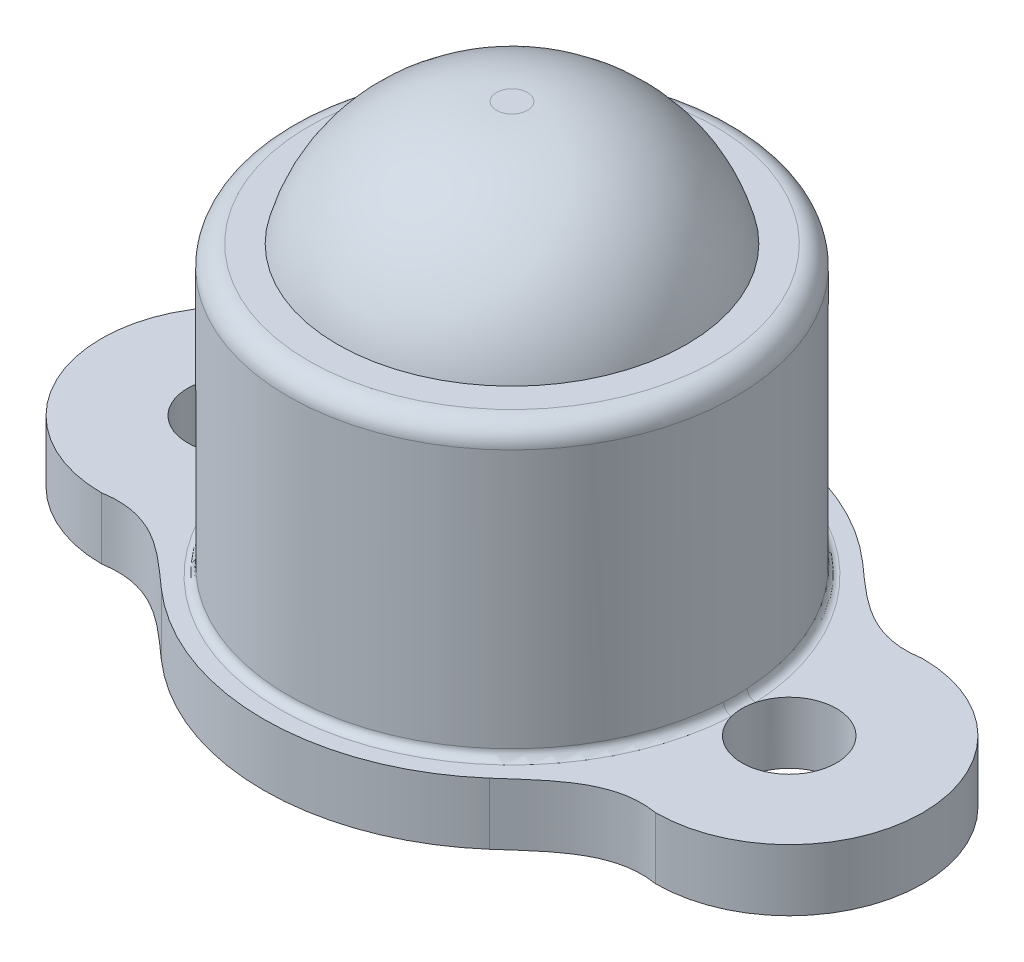
ISO-10303-21;
HEADER;
FILE_DESCRIPTION(('STEP AP214'),'2;1');
FILE_NAME('part.step','',(''),(''),'','','');
FILE_SCHEMA(('AUTOMOTIVE_DESIGN { 1 0 10303 214 1 1 1 1 }'));
ENDSEC;
DATA;
#1=APPLICATION_CONTEXT('core data for automotive mechanical design processes');
#2=APPLICATION_PROTOCOL_DEFINITION('international standard','automotive_design',2000,#1);
#3=PRODUCT_CONTEXT('',#1,'mechanical');
#4=PRODUCT('Part','Part','',(#3));
#5=PRODUCT_RELATED_PRODUCT_CATEGORY('part','',(#4));
#6=PRODUCT_DEFINITION_FORMATION('','',#4);
#7=PRODUCT_DEFINITION_CONTEXT('part definition',#1,'design');
#8=PRODUCT_DEFINITION('design','',#6,#7);
#9=PRODUCT_DEFINITION_SHAPE('','',#8);
#10=(LENGTH_UNIT() NAMED_UNIT(*) SI_UNIT(.MILLI.,.METRE.));
#11=(NAMED_UNIT(*) PLANE_ANGLE_UNIT() SI_UNIT($,.RADIAN.));
#12=(NAMED_UNIT(*) SI_UNIT($,.STERADIAN.) SOLID_ANGLE_UNIT());
#13=UNCERTAINTY_MEASURE_WITH_UNIT(LENGTH_MEASURE(1.E-05),#10,'distance_accuracy_value','');
#14=(GEOMETRIC_REPRESENTATION_CONTEXT(3) GLOBAL_UNCERTAINTY_ASSIGNED_CONTEXT((#13)) GLOBAL_UNIT_ASSIGNED_CONTEXT((#10,
#11,#12)) REPRESENTATION_CONTEXT('',''));
#15=CARTESIAN_POINT('',(0.,0.,0.));
#16=DIRECTION('',(0.,0.,1.));
#17=DIRECTION('',(1.,0.,0.));
#18=AXIS2_PLACEMENT_3D('',#15,#16,#17);
#19=CARTESIAN_POINT('',(0.,8.5,0.));
#20=DIRECTION('',(0.,1.,0.));
#21=DIRECTION('',(0.,0.,1.));
#22=AXIS2_PLACEMENT_3D('',#19,#20,#21);
#23=PLANE('',#22);
#24=CARTESIAN_POINT('',(0.,8.5,0.));
#25=DIRECTION('',(0.,1.,0.));
#26=DIRECTION('',(0.,0.,1.));
#27=AXIS2_PLACEMENT_3D('',#24,#25,#26);
#28=CIRCLE('',#27,4.94689619894046);
#29=CARTESIAN_POINT('',(0.,8.5,4.94689619894046));
#30=VERTEX_POINT('',#29);
#31=EDGE_CURVE('E154',#30,#30,#28,.T.);
#32=ORIENTED_EDGE('',*,*,#31,.T.);
#33=EDGE_LOOP('',(#32));
#34=FACE_BOUND('',#33,.T.);
#35=CARTESIAN_POINT('',(0.,8.5,0.));
#36=DIRECTION('',(0.,1.,0.));
#37=DIRECTION('',(0.,0.,1.));
#38=AXIS2_PLACEMENT_3D('',#35,#36,#37);
#39=CIRCLE('',#38,4.25);
#40=CARTESIAN_POINT('',(0.,8.5,4.25));
#41=VERTEX_POINT('',#40);
#42=EDGE_CURVE('E209',#41,#41,#39,.T.);
#43=ORIENTED_EDGE('',*,*,#42,.F.);
#44=EDGE_LOOP('',(#43));
#45=FACE_BOUND('',#44,.T.);
#46=ADVANCED_FACE('F36',(#34,#45),#23,.T.);
#47=CARTESIAN_POINT('',(0.,1.5,0.));
#48=DIRECTION('',(0.,1.,0.));
#49=DIRECTION('',(0.,0.,1.));
#50=AXIS2_PLACEMENT_3D('',#47,#48,#49);
#51=PLANE('',#50);
#52=CARTESIAN_POINT('',(-6.75,1.5,0.));
#53=DIRECTION('',(0.,1.,0.));
#54=DIRECTION('',(0.,0.,1.));
#55=AXIS2_PLACEMENT_3D('',#52,#53,#54);
#56=CIRCLE('',#55,3.25);
#57=CARTESIAN_POINT('',(-6.75,1.5,-3.25));
#58=VERTEX_POINT('',#57);
#59=CARTESIAN_POINT('',(-6.75,1.5,3.25));
#60=VERTEX_POINT('',#59);
#61=EDGE_CURVE('E138',#58,#60,#56,.T.);
#62=ORIENTED_EDGE('',*,*,#61,.T.);
#63=CARTESIAN_POINT('',(-6.75,1.5,3.25));
#64=CARTESIAN_POINT('',(-5.55717228419837,1.5,3.04653552216127));
#65=CARTESIAN_POINT('',(-4.77819611655397,1.5,3.85536844071539));
#66=CARTESIAN_POINT('',(-3.99231353485115,1.5,4.54575985281276));
#67=B_SPLINE_CURVE_WITH_KNOTS('',3,(#63,#64,#65,#66),.UNSPECIFIED.,.F.,.F.,(4,4),(0.,1.),.UNSPECIFIED.);
#68=CARTESIAN_POINT('',(-3.99231353485115,1.5,4.54575985281276));
#69=VERTEX_POINT('',#68);
#70=EDGE_CURVE('E127',#60,#69,#67,.T.);
#71=ORIENTED_EDGE('',*,*,#70,.T.);
#72=CARTESIAN_POINT('',(0.,1.5,0.));
#73=DIRECTION('',(0.,1.,0.));
#74=DIRECTION('',(0.,0.,1.));
#75=AXIS2_PLACEMENT_3D('',#72,#73,#74);
#76=CIRCLE('',#75,6.05);
#77=CARTESIAN_POINT('',(3.99231353485115,1.5,4.54575985281276));
#78=VERTEX_POINT('',#77);
#79=EDGE_CURVE('E137',#69,#78,#76,.T.);
#80=ORIENTED_EDGE('',*,*,#79,.T.);
#81=CARTESIAN_POINT('',(6.75,1.5,3.25));
#82=CARTESIAN_POINT('',(5.55717228419837,1.5,3.04653552216127));
#83=CARTESIAN_POINT('',(4.77819611655397,1.5,3.85536844071539));
#84=CARTESIAN_POINT('',(3.99231353485115,1.5,4.54575985281276));
#85=B_SPLINE_CURVE_WITH_KNOTS('',3,(#81,#82,#83,#84),.UNSPECIFIED.,.F.,.F.,(4,4),(0.,1.),.UNSPECIFIED.);
#86=CARTESIAN_POINT('',(6.75,1.5,3.25));
#87=VERTEX_POINT('',#86);
#88=EDGE_CURVE('E281',#87,#78,#85,.T.);
#89=ORIENTED_EDGE('',*,*,#88,.F.);
#90=CARTESIAN_POINT('',(6.75,1.5,0.));
#91=DIRECTION('',(0.,1.,0.));
#92=DIRECTION('',(0.,0.,1.));
#93=AXIS2_PLACEMENT_3D('',#90,#91,#92);
#94=CIRCLE('',#93,3.25);
#95=CARTESIAN_POINT('',(6.75,1.5,-3.25));
#96=VERTEX_POINT('',#95);
#97=EDGE_CURVE('E288',#96,#87,#94,.F.);
#98=ORIENTED_EDGE('',*,*,#97,.F.);
#99=CARTESIAN_POINT('',(6.75,1.5,-3.25));
#100=CARTESIAN_POINT('',(5.55717228419837,1.5,-3.04653552216127));
#101=CARTESIAN_POINT('',(4.77819611655397,1.5,-3.85536844071539));
#102=CARTESIAN_POINT('',(3.99231353485115,1.5,-4.54575985281276));
#103=B_SPLINE_CURVE_WITH_KNOTS('',3,(#99,#100,#101,#102),.UNSPECIFIED.,.F.,.F.,(4,4),(0.,1.),.UNSPECIFIED.);
#104=CARTESIAN_POINT('',(3.99231353485115,1.5,-4.54575985281276));
#105=VERTEX_POINT('',#104);
#106=EDGE_CURVE('E294',#96,#105,#103,.T.);
#107=ORIENTED_EDGE('',*,*,#106,.T.);
#108=CARTESIAN_POINT('',(-3.99231353485115,1.5,-4.54575985281276));
#109=VERTEX_POINT('',#108);
#110=EDGE_CURVE('E282',#105,#109,#76,.T.);
#111=ORIENTED_EDGE('',*,*,#110,.T.);
#112=CARTESIAN_POINT('',(-6.75,1.5,-3.25));
#113=CARTESIAN_POINT('',(-5.55717228419837,1.5,-3.04653552216127));
#114=CARTESIAN_POINT('',(-4.77819611655397,1.5,-3.85536844071539));
#115=CARTESIAN_POINT('',(-3.99231353485115,1.5,-4.54575985281276));
#116=B_SPLINE_CURVE_WITH_KNOTS('',3,(#112,#113,#114,#115),.UNSPECIFIED.,.F.,.F.,(4,4),(0.,1.),.UNSPECIFIED.);
#117=EDGE_CURVE('E144',#58,#109,#116,.T.);
#118=ORIENTED_EDGE('',*,*,#117,.F.);
#119=EDGE_LOOP('',(#62,#71,#80,#89,#98,#107,#111,#118));
#120=FACE_BOUND('',#119,.T.);
#121=CARTESIAN_POINT('',(-6.75,1.5,0.));
#122=DIRECTION('',(0.,1.,0.));
#123=DIRECTION('',(0.,0.,1.));
#124=AXIS2_PLACEMENT_3D('',#121,#122,#123);
#125=CIRCLE('',#124,1.15);
#126=CARTESIAN_POINT('',(-5.63906938382283,1.5,-0.297208960228696));
#127=VERTEX_POINT('',#126);
#128=CARTESIAN_POINT('',(-5.63906938382283,1.5,0.297208960228696));
#129=VERTEX_POINT('',#128);
#130=EDGE_CURVE('E393',#127,#129,#125,.T.);
#131=ORIENTED_EDGE('',*,*,#130,.F.);
#132=CARTESIAN_POINT('',(0.,1.5,0.));
#133=DIRECTION('',(0.,1.,0.));
#134=DIRECTION('',(0.,0.,1.));
#135=AXIS2_PLACEMENT_3D('',#132,#133,#134);
#136=CIRCLE('',#135,5.64689619894046);
#137=CARTESIAN_POINT('',(5.63906938382283,1.5,-0.297208960228695));
#138=VERTEX_POINT('',#137);
#139=EDGE_CURVE('E11',#127,#138,#136,.F.);
#140=ORIENTED_EDGE('',*,*,#139,.T.);
#141=CARTESIAN_POINT('',(6.75,1.5,0.));
#142=DIRECTION('',(0.,1.,0.));
#143=DIRECTION('',(0.,0.,-1.));
#144=AXIS2_PLACEMENT_3D('',#141,#142,#143);
#145=CIRCLE('',#144,1.15);
#146=CARTESIAN_POINT('',(5.63906938382283,1.5,0.297208960228699));
#147=VERTEX_POINT('',#146);
#148=EDGE_CURVE('E55',#147,#138,#145,.T.);
#149=ORIENTED_EDGE('',*,*,#148,.F.);
#150=CARTESIAN_POINT('',(0.,1.5,0.));
#151=DIRECTION('',(0.,1.,0.));
#152=DIRECTION('',(0.,0.,1.));
#153=AXIS2_PLACEMENT_3D('',#150,#151,#152);
#154=CIRCLE('',#153,5.64689619894046);
#155=EDGE_CURVE('E48',#147,#129,#154,.F.);
#156=ORIENTED_EDGE('',*,*,#155,.T.);
#157=EDGE_LOOP('',(#131,#140,#149,#156));
#158=FACE_BOUND('',#157,.T.);
#159=ADVANCED_FACE('F142',(#120,#158),#51,.T.);
#160=CARTESIAN_POINT('',(-6.75,1.5,0.));
#161=DIRECTION('',(0.,-1.,0.));
#162=DIRECTION('',(0.,0.,-1.));
#163=AXIS2_PLACEMENT_3D('',#160,#161,#162);
#164=CYLINDRICAL_SURFACE('',#163,3.25);
#165=CARTESIAN_POINT('',(-6.75,0.,0.));
#166=DIRECTION('',(0.,1.,0.));
#167=DIRECTION('',(0.,0.,1.));
#168=AXIS2_PLACEMENT_3D('',#165,#166,#167);
#169=CIRCLE('',#168,3.25);
#170=CARTESIAN_POINT('',(-6.75,0.,-3.25));
#171=VERTEX_POINT('',#170);
#172=CARTESIAN_POINT('',(-6.75,0.,3.25));
#173=VERTEX_POINT('',#172);
#174=EDGE_CURVE('E150',#171,#173,#169,.T.);
#175=ORIENTED_EDGE('',*,*,#174,.T.);
#176=DIRECTION('',(0.,-1.,0.));
#177=VECTOR('',#176,1.);
#178=CARTESIAN_POINT('',(-6.75,1.5,3.25));
#179=LINE('',#178,#177);
#180=EDGE_CURVE('E131',#60,#173,#179,.T.);
#181=ORIENTED_EDGE('',*,*,#180,.F.);
#182=ORIENTED_EDGE('',*,*,#61,.F.);
#183=DIRECTION('',(0.,-1.,0.));
#184=VECTOR('',#183,1.);
#185=CARTESIAN_POINT('',(-6.75,1.5,-3.25));
#186=LINE('',#185,#184);
#187=EDGE_CURVE('E356',#58,#171,#186,.T.);
#188=ORIENTED_EDGE('',*,*,#187,.T.);
#189=EDGE_LOOP('',(#175,#181,#182,#188));
#190=FACE_BOUND('',#189,.T.);
#191=ADVANCED_FACE('F148',(#190),#164,.T.);
#192=DIRECTION('',(0.,-1.,0.));
#193=VECTOR('',#192,1.);
#194=SURFACE_OF_LINEAR_EXTRUSION('',#67,#193);
#195=CARTESIAN_POINT('',(-6.75,0.,3.25));
#196=CARTESIAN_POINT('',(-5.55717228419837,0.,3.04653552216127));
#197=CARTESIAN_POINT('',(-4.77819611655397,0.,3.85536844071539));
#198=CARTESIAN_POINT('',(-3.99231353485115,0.,4.54575985281276));
#199=B_SPLINE_CURVE_WITH_KNOTS('',3,(#195,#196,#197,#198),.UNSPECIFIED.,.F.,.F.,(4,4),(0.,1.),.UNSPECIFIED.);
#200=CARTESIAN_POINT('',(-3.99231353485115,0.,4.54575985281276));
#201=VERTEX_POINT('',#200);
#202=EDGE_CURVE('E369',#173,#201,#199,.T.);
#203=ORIENTED_EDGE('',*,*,#202,.T.);
#204=DIRECTION('',(0.,-1.,0.));
#205=VECTOR('',#204,1.);
#206=CARTESIAN_POINT('',(-3.99231353485115,1.5,4.54575985281276));
#207=LINE('',#206,#205);
#208=EDGE_CURVE('E134',#69,#201,#207,.T.);
#209=ORIENTED_EDGE('',*,*,#208,.F.);
#210=ORIENTED_EDGE('',*,*,#70,.F.);
#211=ORIENTED_EDGE('',*,*,#180,.T.);
#212=EDGE_LOOP('',(#203,#209,#210,#211));
#213=FACE_BOUND('',#212,.T.);
#214=ADVANCED_FACE('F129',(#213),#194,.F.);
#215=CARTESIAN_POINT('',(0.,1.5,0.));
#216=DIRECTION('',(0.,-1.,0.));
#217=DIRECTION('',(0.,0.,-1.));
#218=AXIS2_PLACEMENT_3D('',#215,#216,#217);
#219=CYLINDRICAL_SURFACE('',#218,6.05);
#220=CARTESIAN_POINT('',(0.,0.,0.));
#221=DIRECTION('',(0.,1.,0.));
#222=DIRECTION('',(0.,0.,1.));
#223=AXIS2_PLACEMENT_3D('',#220,#221,#222);
#224=CIRCLE('',#223,6.05);
#225=CARTESIAN_POINT('',(3.99231353485115,0.,4.54575985281276));
#226=VERTEX_POINT('',#225);
#227=EDGE_CURVE('E335',#201,#226,#224,.T.);
#228=ORIENTED_EDGE('',*,*,#227,.T.);
#229=DIRECTION('',(0.,-1.,0.));
#230=VECTOR('',#229,1.);
#231=CARTESIAN_POINT('',(3.99231353485115,1.5,4.54575985281276));
#232=LINE('',#231,#230);
#233=EDGE_CURVE('E156',#78,#226,#232,.T.);
#234=ORIENTED_EDGE('',*,*,#233,.F.);
#235=ORIENTED_EDGE('',*,*,#79,.F.);
#236=ORIENTED_EDGE('',*,*,#208,.T.);
#237=EDGE_LOOP('',(#228,#234,#235,#236));
#238=FACE_BOUND('',#237,.T.);
#239=ADVANCED_FACE('F269',(#238),#219,.T.);
#240=DIRECTION('',(0.,-1.,0.));
#241=VECTOR('',#240,1.);
#242=SURFACE_OF_LINEAR_EXTRUSION('',#85,#241);
#243=CARTESIAN_POINT('',(6.75,0.,3.25));
#244=CARTESIAN_POINT('',(5.55717228419837,0.,3.04653552216127));
#245=CARTESIAN_POINT('',(4.77819611655397,0.,3.85536844071539));
#246=CARTESIAN_POINT('',(3.99231353485115,0.,4.54575985281276));
#247=B_SPLINE_CURVE_WITH_KNOTS('',3,(#243,#244,#245,#246),.UNSPECIFIED.,.F.,.F.,(4,4),(0.,1.),.UNSPECIFIED.);
#248=CARTESIAN_POINT('',(6.75,0.,3.25));
#249=VERTEX_POINT('',#248);
#250=EDGE_CURVE('E331',#249,#226,#247,.T.);
#251=ORIENTED_EDGE('',*,*,#250,.F.);
#252=DIRECTION('',(0.,-1.,0.));
#253=VECTOR('',#252,1.);
#254=CARTESIAN_POINT('',(6.75,1.5,3.25));
#255=LINE('',#254,#253);
#256=EDGE_CURVE('E325',#87,#249,#255,.T.);
#257=ORIENTED_EDGE('',*,*,#256,.F.);
#258=ORIENTED_EDGE('',*,*,#88,.T.);
#259=ORIENTED_EDGE('',*,*,#233,.T.);
#260=EDGE_LOOP('',(#251,#257,#258,#259));
#261=FACE_BOUND('',#260,.T.);
#262=ADVANCED_FACE('F270',(#261),#242,.T.);
#263=CARTESIAN_POINT('',(6.75,1.5,0.));
#264=DIRECTION('',(0.,-1.,0.));
#265=DIRECTION('',(0.,0.,-1.));
#266=AXIS2_PLACEMENT_3D('',#263,#264,#265);
#267=CYLINDRICAL_SURFACE('',#266,3.25);
#268=CARTESIAN_POINT('',(6.75,0.,0.));
#269=DIRECTION('',(0.,1.,0.));
#270=DIRECTION('',(0.,0.,1.));
#271=AXIS2_PLACEMENT_3D('',#268,#269,#270);
#272=CIRCLE('',#271,3.25);
#273=CARTESIAN_POINT('',(6.75,0.,-3.25));
#274=VERTEX_POINT('',#273);
#275=EDGE_CURVE('E322',#274,#249,#272,.F.);
#276=ORIENTED_EDGE('',*,*,#275,.F.);
#277=DIRECTION('',(0.,-1.,0.));
#278=VECTOR('',#277,1.);
#279=CARTESIAN_POINT('',(6.75,1.5,-3.25));
#280=LINE('',#279,#278);
#281=EDGE_CURVE('E323',#96,#274,#280,.T.);
#282=ORIENTED_EDGE('',*,*,#281,.F.);
#283=ORIENTED_EDGE('',*,*,#97,.T.);
#284=ORIENTED_EDGE('',*,*,#256,.T.);
#285=EDGE_LOOP('',(#276,#282,#283,#284));
#286=FACE_BOUND('',#285,.T.);
#287=ADVANCED_FACE('F311',(#286),#267,.T.);
#288=DIRECTION('',(0.,-1.,0.));
#289=VECTOR('',#288,1.);
#290=SURFACE_OF_LINEAR_EXTRUSION('',#103,#289);
#291=CARTESIAN_POINT('',(6.75,0.,-3.25));
#292=CARTESIAN_POINT('',(5.55717228419837,0.,-3.04653552216127));
#293=CARTESIAN_POINT('',(4.77819611655397,0.,-3.85536844071539));
#294=CARTESIAN_POINT('',(3.99231353485115,0.,-4.54575985281276));
#295=B_SPLINE_CURVE_WITH_KNOTS('',3,(#291,#292,#293,#294),.UNSPECIFIED.,.F.,.F.,(4,4),(0.,1.),.UNSPECIFIED.);
#296=CARTESIAN_POINT('',(3.99231353485115,0.,-4.54575985281276));
#297=VERTEX_POINT('',#296);
#298=EDGE_CURVE('E330',#274,#297,#295,.T.);
#299=ORIENTED_EDGE('',*,*,#298,.T.);
#300=DIRECTION('',(0.,-1.,0.));
#301=VECTOR('',#300,1.);
#302=CARTESIAN_POINT('',(3.99231353485115,1.5,-4.54575985281276));
#303=LINE('',#302,#301);
#304=EDGE_CURVE('E360',#105,#297,#303,.T.);
#305=ORIENTED_EDGE('',*,*,#304,.F.);
#306=ORIENTED_EDGE('',*,*,#106,.F.);
#307=ORIENTED_EDGE('',*,*,#281,.T.);
#308=EDGE_LOOP('',(#299,#305,#306,#307));
#309=FACE_BOUND('',#308,.T.);
#310=ADVANCED_FACE('F307',(#309),#290,.F.);
#311=CARTESIAN_POINT('',(-3.99231353485115,0.,-4.54575985281276));
#312=VERTEX_POINT('',#311);
#313=EDGE_CURVE('E333',#297,#312,#224,.T.);
#314=ORIENTED_EDGE('',*,*,#313,.T.);
#315=DIRECTION('',(0.,-1.,0.));
#316=VECTOR('',#315,1.);
#317=CARTESIAN_POINT('',(-3.99231353485115,1.5,-4.54575985281276));
#318=LINE('',#317,#316);
#319=EDGE_CURVE('E358',#109,#312,#318,.T.);
#320=ORIENTED_EDGE('',*,*,#319,.F.);
#321=ORIENTED_EDGE('',*,*,#110,.F.);
#322=ORIENTED_EDGE('',*,*,#304,.T.);
#323=EDGE_LOOP('',(#314,#320,#321,#322));
#324=FACE_BOUND('',#323,.T.);
#325=ADVANCED_FACE('F310',(#324),#219,.T.);
#326=DIRECTION('',(0.,-1.,0.));
#327=VECTOR('',#326,1.);
#328=SURFACE_OF_LINEAR_EXTRUSION('',#116,#327);
#329=CARTESIAN_POINT('',(-6.75,0.,-3.25));
#330=CARTESIAN_POINT('',(-5.55717228419837,0.,-3.04653552216127));
#331=CARTESIAN_POINT('',(-4.77819611655397,0.,-3.85536844071539));
#332=CARTESIAN_POINT('',(-3.99231353485115,0.,-4.54575985281276));
#333=B_SPLINE_CURVE_WITH_KNOTS('',3,(#329,#330,#331,#332),.UNSPECIFIED.,.F.,.F.,(4,4),(0.,1.),.UNSPECIFIED.);
#334=EDGE_CURVE('E343',#171,#312,#333,.T.);
#335=ORIENTED_EDGE('',*,*,#334,.F.);
#336=ORIENTED_EDGE('',*,*,#187,.F.);
#337=ORIENTED_EDGE('',*,*,#117,.T.);
#338=ORIENTED_EDGE('',*,*,#319,.T.);
#339=EDGE_LOOP('',(#335,#336,#337,#338));
#340=FACE_BOUND('',#339,.T.);
#341=ADVANCED_FACE('F381',(#340),#328,.T.);
#342=CARTESIAN_POINT('',(0.,1.5,0.));
#343=DIRECTION('',(0.,-1.,0.));
#344=DIRECTION('',(0.,0.,-1.));
#345=AXIS2_PLACEMENT_3D('',#342,#343,#344);
#346=CYLINDRICAL_SURFACE('',#345,2.94689619894046);
#347=CARTESIAN_POINT('',(0.,0.,0.));
#348=DIRECTION('',(0.,1.,0.));
#349=DIRECTION('',(0.,0.,1.));
#350=AXIS2_PLACEMENT_3D('',#347,#348,#349);
#351=CIRCLE('',#350,2.94689619894046);
#352=CARTESIAN_POINT('',(0.,0.,2.94689619894046));
#353=VERTEX_POINT('',#352);
#354=EDGE_CURVE('E146',#353,#353,#351,.T.);
#355=ORIENTED_EDGE('',*,*,#354,.F.);
#356=EDGE_LOOP('',(#355));
#357=FACE_BOUND('',#356,.T.);
#358=CARTESIAN_POINT('',(0.,8.5,0.));
#359=DIRECTION('',(0.,1.,0.));
#360=DIRECTION('',(0.,0.,1.));
#361=AXIS2_PLACEMENT_3D('',#358,#359,#360);
#362=CIRCLE('',#361,2.94689619894046);
#363=CARTESIAN_POINT('',(0.,8.5,2.94689619894046));
#364=VERTEX_POINT('',#363);
#365=EDGE_CURVE('E385',#364,#364,#362,.F.);
#366=ORIENTED_EDGE('',*,*,#365,.F.);
#367=EDGE_LOOP('',(#366));
#368=FACE_BOUND('',#367,.T.);
#369=ADVANCED_FACE('F375',(#357,#368),#346,.F.);
#370=CARTESIAN_POINT('',(0.,0.,0.));
#371=DIRECTION('',(0.,1.,0.));
#372=DIRECTION('',(0.,0.,1.));
#373=AXIS2_PLACEMENT_3D('',#370,#371,#372);
#374=PLANE('',#373);
#375=CARTESIAN_POINT('',(6.75,0.,0.));
#376=DIRECTION('',(0.,1.,0.));
#377=DIRECTION('',(0.,0.,-1.));
#378=AXIS2_PLACEMENT_3D('',#375,#376,#377);
#379=CIRCLE('',#378,1.15);
#380=CARTESIAN_POINT('',(6.75,0.,-1.15));
#381=VERTEX_POINT('',#380);
#382=EDGE_CURVE('E391',#381,#381,#379,.T.);
#383=ORIENTED_EDGE('',*,*,#382,.T.);
#384=EDGE_LOOP('',(#383));
#385=FACE_BOUND('',#384,.T.);
#386=CARTESIAN_POINT('',(-6.75,0.,0.));
#387=DIRECTION('',(0.,1.,0.));
#388=DIRECTION('',(0.,0.,1.));
#389=AXIS2_PLACEMENT_3D('',#386,#387,#388);
#390=CIRCLE('',#389,1.15);
#391=CARTESIAN_POINT('',(-6.75,0.,1.15));
#392=VERTEX_POINT('',#391);
#393=EDGE_CURVE('E395',#392,#392,#390,.T.);
#394=ORIENTED_EDGE('',*,*,#393,.T.);
#395=EDGE_LOOP('',(#394));
#396=FACE_BOUND('',#395,.T.);
#397=ORIENTED_EDGE('',*,*,#174,.F.);
#398=ORIENTED_EDGE('',*,*,#334,.T.);
#399=ORIENTED_EDGE('',*,*,#313,.F.);
#400=ORIENTED_EDGE('',*,*,#298,.F.);
#401=ORIENTED_EDGE('',*,*,#275,.T.);
#402=ORIENTED_EDGE('',*,*,#250,.T.);
#403=ORIENTED_EDGE('',*,*,#227,.F.);
#404=ORIENTED_EDGE('',*,*,#202,.F.);
#405=EDGE_LOOP('',(#397,#398,#399,#400,#401,#402,#403,#404));
#406=FACE_BOUND('',#405,.T.);
#407=ORIENTED_EDGE('',*,*,#354,.T.);
#408=EDGE_LOOP('',(#407));
#409=FACE_BOUND('',#408,.T.);
#410=ADVANCED_FACE('F370',(#385,#396,#406,#409),#374,.F.);
#411=CARTESIAN_POINT('',(-6.75,0.,0.));
#412=DIRECTION('',(0.,1.,0.));
#413=DIRECTION('',(0.,0.,1.));
#414=AXIS2_PLACEMENT_3D('',#411,#412,#413);
#415=CYLINDRICAL_SURFACE('',#414,1.15);
#416=ORIENTED_EDGE('',*,*,#393,.F.);
#417=EDGE_LOOP('',(#416));
#418=FACE_BOUND('',#417,.T.);
#419=EDGE_CURVE('E397',#129,#127,#125,.T.);
#420=ORIENTED_EDGE('',*,*,#419,.T.);
#421=ORIENTED_EDGE('',*,*,#130,.T.);
#422=EDGE_LOOP('',(#420,#421));
#423=FACE_BOUND('',#422,.T.);
#424=ADVANCED_FACE('F374',(#418,#423),#415,.F.);
#425=CARTESIAN_POINT('',(6.75,0.,0.));
#426=DIRECTION('',(0.,1.,0.));
#427=DIRECTION('',(0.,0.,1.));
#428=AXIS2_PLACEMENT_3D('',#425,#426,#427);
#429=CYLINDRICAL_SURFACE('',#428,1.15);
#430=ORIENTED_EDGE('',*,*,#382,.F.);
#431=EDGE_LOOP('',(#430));
#432=FACE_BOUND('',#431,.T.);
#433=EDGE_CURVE('E387',#138,#147,#145,.T.);
#434=ORIENTED_EDGE('',*,*,#433,.T.);
#435=ORIENTED_EDGE('',*,*,#148,.T.);
#436=EDGE_LOOP('',(#434,#435));
#437=FACE_BOUND('',#436,.T.);
#438=ADVANCED_FACE('F202',(#432,#437),#429,.F.);
#439=CARTESIAN_POINT('',(0.,8.5,0.));
#440=DIRECTION('',(0.,-1.,0.));
#441=DIRECTION('',(0.,0.,-1.));
#442=AXIS2_PLACEMENT_3D('',#439,#440,#441);
#443=CYLINDRICAL_SURFACE('',#442,5.44689619894046);
#444=CARTESIAN_POINT('',(0.,1.7,0.));
#445=DIRECTION('',(0.,1.,0.));
#446=DIRECTION('',(0.,0.,1.));
#447=AXIS2_PLACEMENT_3D('',#444,#445,#446);
#448=CIRCLE('',#447,5.44689619894046);
#449=CARTESIAN_POINT('',(5.43934659150797,1.7,-0.286682506412013));
#450=VERTEX_POINT('',#449);
#451=CARTESIAN_POINT('',(-5.43934659150797,1.7,-0.286682506412014));
#452=VERTEX_POINT('',#451);
#453=EDGE_CURVE('E165',#450,#452,#448,.T.);
#454=ORIENTED_EDGE('',*,*,#453,.T.);
#455=CARTESIAN_POINT('',(-5.4235190524168,1.67727950532013,-0.504102459926552));
#456=CARTESIAN_POINT('',(-5.43070076971012,1.38173068395291,-0.426836063378881));
#457=CARTESIAN_POINT('',(-5.70665870784337,1.5,-0.483672356126479));
#458=CARTESIAN_POINT('',(-5.42565670047543,1.68349660454197,-0.481133907770004));
#459=CARTESIAN_POINT('',(-5.43077758593432,1.40030054344534,-0.422785831983225));
#460=CARTESIAN_POINT('',(-5.69861394321352,1.5,-0.466340194467271));
#461=CARTESIAN_POINT('',(-5.42767190245897,1.68804159533558,-0.457841524957272));
#462=CARTESIAN_POINT('',(-5.4314133194152,1.41739954765745,-0.413082637502617));
#463=CARTESIAN_POINT('',(-5.69062529798567,1.5,-0.447955237972466));
#464=CARTESIAN_POINT('',(-5.43141644634372,1.69466154986054,-0.411015851769007));
#465=CARTESIAN_POINT('',(-5.43321072082022,1.44693869633108,-0.386709889490867));
#466=CARTESIAN_POINT('',(-5.67515611943556,1.5,-0.409430970072772));
#467=CARTESIAN_POINT('',(-5.43314718513049,1.69674891409758,-0.387484380400831));
#468=CARTESIAN_POINT('',(-5.43434641607273,1.45978690391992,-0.370374319266718));
#469=CARTESIAN_POINT('',(-5.6676732163382,1.5,-0.389301021264652));
#470=CARTESIAN_POINT('',(-5.436296465662,1.69936639289213,-0.340463082000713));
#471=CARTESIAN_POINT('',(-5.43667402711847,1.48132474589723,-0.334066370717892));
#472=CARTESIAN_POINT('',(-5.65355701806841,1.5,-0.347558740185773));
#473=CARTESIAN_POINT('',(-5.43771648220679,1.69990401806429,-0.316973607369686));
#474=CARTESIAN_POINT('',(-5.43787219246013,1.49030815119144,-0.314135680125248));
#475=CARTESIAN_POINT('',(-5.64691977474829,1.5,-0.32595407868118));
#476=CARTESIAN_POINT('',(-5.44025380746517,1.70007183865785,-0.269946475588933));
#477=CARTESIAN_POINT('',(-5.44013197073995,1.50520363305062,-0.272158347935737));
#478=CARTESIAN_POINT('',(-5.63470825495002,1.5,-0.281356226855839));
#479=CARTESIAN_POINT('',(-5.44137069480515,1.69970077803812,-0.246408796731536));
#480=CARTESIAN_POINT('',(-5.44120751119222,1.51128205486146,-0.250012717699331));
#481=CARTESIAN_POINT('',(-5.62913546129458,1.5,-0.258361157467956));
#482=CARTESIAN_POINT('',(-5.44438895542486,1.69800246416573,-0.172711044394734));
#483=CARTESIAN_POINT('',(-5.44412624741176,1.52641658596099,-0.179904297475389));
#484=CARTESIAN_POINT('',(-5.61375895444039,1.5,-0.184579689991734));
#485=CARTESIAN_POINT('',(-5.44574922762309,1.69606842507223,-0.122544571571133));
#486=CARTESIAN_POINT('',(-5.44565302713678,1.53222494947881,-0.127718757035615));
#487=CARTESIAN_POINT('',(-5.60629701360133,1.5,-0.131771189064923));
#488=CARTESIAN_POINT('',(-5.4470826655772,1.69419736932644,-0.0221141700457301));
#489=CARTESIAN_POINT('',(-5.44708845993309,1.53772004130409,-0.0237107684340233));
#490=CARTESIAN_POINT('',(-5.59899381467766,1.5,-0.0241448204670984));
#491=CARTESIAN_POINT('',(-5.44705494559254,1.69426162786828,0.0281498004180865));
#492=CARTESIAN_POINT('',(-5.44705187402875,1.53761514605763,0.0300601375778517));
#493=CARTESIAN_POINT('',(-5.59915742279594,1.5,0.0306743079822824));
#494=CARTESIAN_POINT('',(-5.44585282717895,1.69590751173711,0.111699660513613));
#495=CARTESIAN_POINT('',(-5.44577169114925,1.53265830027411,0.116193551686797));
#496=CARTESIAN_POINT('',(-5.60572220288123,1.5,0.120103340723799));
#497=CARTESIAN_POINT('',(-5.44506761030572,1.69697101862934,0.145004489002799));
#498=CARTESIAN_POINT('',(-5.44491600277162,1.52932846321708,0.150561810792077));
#499=CARTESIAN_POINT('',(-5.61000489866518,1.5,0.155303699041868));
#500=CARTESIAN_POINT('',(-5.44288769489912,1.69893698759419,0.211565392156619));
#501=CARTESIAN_POINT('',(-5.44268280077241,1.51909984428065,0.216865509301681));
#502=CARTESIAN_POINT('',(-5.62144768616225,1.5,0.223764409386533));
#503=CARTESIAN_POINT('',(-5.44149356699263,1.69983959933351,0.244821483288501));
#504=CARTESIAN_POINT('',(-5.44127053755381,1.51200627952832,0.249291005262641));
#505=CARTESIAN_POINT('',(-5.62860508341158,1.5,0.257026544776273));
#506=CARTESIAN_POINT('',(-5.43802602422379,1.70012895819966,0.312644013203008));
#507=CARTESIAN_POINT('',(-5.43809297757347,1.4922433284701,0.311217541045197));
#508=CARTESIAN_POINT('',(-5.64551843114877,1.5,0.322175983666487));
#509=CARTESIAN_POINT('',(-5.43592818098061,1.69945505616225,0.347210845199417));
#510=CARTESIAN_POINT('',(-5.43627242919409,1.47890204316493,0.340843188836098));
#511=CARTESIAN_POINT('',(-5.65536504140039,1.5,0.353958682421364));
#512=CARTESIAN_POINT('',(-5.43229337658369,1.69563935087287,0.39895826896801));
#513=CARTESIAN_POINT('',(-5.43382528608136,1.45359612938084,0.377928153949843));
#514=CARTESIAN_POINT('',(-5.67134292976575,1.5,0.399069076214963));
#515=CARTESIAN_POINT('',(-5.43099611414659,1.69389111200626,0.416238486233691));
#516=CARTESIAN_POINT('',(-5.43303065136548,1.44383410349031,0.389396877801614));
#517=CARTESIAN_POINT('',(-5.67688744723624,1.5,0.413715959964618));
#518=CARTESIAN_POINT('',(-5.42824919789447,1.6890873776212,0.45065485982982));
#519=CARTESIAN_POINT('',(-5.43169468429337,1.42216613033548,0.408913191964405));
#520=CARTESIAN_POINT('',(-5.68824545937749,1.5,0.442054160900243));
#521=CARTESIAN_POINT('',(-5.42679918564396,1.68602875325999,0.467790570618371));
#522=CARTESIAN_POINT('',(-5.43116277696528,1.41010003330895,0.416837076051408));
#523=CARTESIAN_POINT('',(-5.69405956793639,1.5,0.455743099178282));
#524=CARTESIAN_POINT('',(-5.42528087508953,1.68213576970775,0.484773790978742));
#525=CARTESIAN_POINT('',(-5.43088708762353,1.39722410217698,0.422032615179994));
#526=CARTESIAN_POINT('',(-5.69993058563361,1.5,0.468886153572735));
#527=(BOUNDED_SURFACE() B_SPLINE_SURFACE(3,2,((#455,#456,#457),(#458,#459,#460),(#461,#462,
#463),(#464,#465,#466),(#467,#468,#469),(#470,#471,#472),(#473,#474,#475),(#476,#477,#478),
(#479,#480,#481),(#482,#483,#484),(#485,#486,#487),(#488,#489,#490),(#491,#492,#493),(#494,#495,
#496),(#497,#498,#499),(#500,#501,#502),(#503,#504,#505),(#506,#507,#508),(#509,#510,#511),
(#512,#513,#514),(#515,#516,#517),(#518,#519,#520),(#521,#522,#523),(#524,#525,#526)),
.UNSPECIFIED.,.F.,.F.,.F.) B_SPLINE_SURFACE_WITH_KNOTS((4,2,2,2,2,2,2,2,2,2,2,4),(3,3),(0.,
0.0739169850604639,0.147459384915979,0.220644766623378,0.293931366730879,0.450091476461137,
0.606351240285779,0.710004724929268,0.813561280827954,0.921166828611147,0.975273297223309,
1.02950968370675),(0.,1.),
.UNSPECIFIED.) GEOMETRIC_REPRESENTATION_ITEM() RATIONAL_B_SPLINE_SURFACE(((1.,0.547645661999465,
1.),(1.,0.56913384705998,1.),(1.,0.589331579400989,1.),(1.,0.626883842775,1.),(1.,
0.644252263450306,1.),(1.,0.67602738129211,1.),(1.,0.690448047087672,1.),(1.,0.716374570277887,
1.),(1.,0.72787636878846,1.),(1.,0.759133473871642,1.),(1.,0.773514150520819,1.),(1.,
0.78760584786103,1.),(1.,0.787307501205851,1.),(1.,0.774611694589233,1.),(1.,0.766321326248267,
1.),(1.,0.74356339039567,1.),(1.,0.729101606573853,1.),(1.,0.693573380360763,1.),(1.,
0.672270808810171,1.),(1.,0.635677192002064,1.),(1.,0.62266304031043,1.),(1.,0.595125650644278,
1.),(1.,0.580598864157281,1.),(1.,0.56536316242677,1.))) REPRESENTATION_ITEM('') SURFACE());
#528=CARTESIAN_POINT('',(-5.4235190524168,1.67727950532013,-0.504102459926552));
#529=CARTESIAN_POINT('',(-5.42565670047543,1.68349660454197,-0.481133907770004));
#530=CARTESIAN_POINT('',(-5.42767190245897,1.68804159533558,-0.457841524957272));
#531=CARTESIAN_POINT('',(-5.43141644634372,1.69466154986054,-0.411015851769007));
#532=CARTESIAN_POINT('',(-5.43314718513049,1.69674891409758,-0.387484380400831));
#533=CARTESIAN_POINT('',(-5.436296465662,1.69936639289213,-0.340463082000713));
#534=CARTESIAN_POINT('',(-5.43771648220679,1.69990401806429,-0.316973607369686));
#535=CARTESIAN_POINT('',(-5.44025380746517,1.70007183865785,-0.269946475588933));
#536=CARTESIAN_POINT('',(-5.44137069480515,1.69970077803812,-0.246408796731536));
#537=CARTESIAN_POINT('',(-5.44438895542486,1.69800246416573,-0.172711044394734));
#538=CARTESIAN_POINT('',(-5.44574922762309,1.69606842507223,-0.122544571571133));
#539=CARTESIAN_POINT('',(-5.4470826655772,1.69419736932644,-0.0221141700457301));
#540=CARTESIAN_POINT('',(-5.44705494559254,1.69426162786828,0.0281498004180865));
#541=CARTESIAN_POINT('',(-5.44585282717895,1.69590751173711,0.111699660513613));
#542=CARTESIAN_POINT('',(-5.44506761030572,1.69697101862934,0.145004489002799));
#543=CARTESIAN_POINT('',(-5.44288769489912,1.69893698759419,0.211565392156619));
#544=CARTESIAN_POINT('',(-5.44149356699263,1.69983959933351,0.244821483288501));
#545=CARTESIAN_POINT('',(-5.43802602422379,1.70012895819966,0.312644013203008));
#546=CARTESIAN_POINT('',(-5.43592818098061,1.69945505616225,0.347210845199417));
#547=CARTESIAN_POINT('',(-5.43229337658369,1.69563935087287,0.39895826896801));
#548=CARTESIAN_POINT('',(-5.43099611414659,1.69389111200626,0.416238486233691));
#549=CARTESIAN_POINT('',(-5.42824919789447,1.6890873776212,0.45065485982982));
#550=CARTESIAN_POINT('',(-5.42679918564396,1.68602875325999,0.467790570618371));
#551=CARTESIAN_POINT('',(-5.42528087508953,1.68213576970775,0.484773790978742));
#552=B_SPLINE_CURVE_WITH_KNOTS('',3,(#528,#529,#530,#531,#532,#533,#534,#535,#536,#537,#538,
#539,#540,#541,#542,#543,#544,#545,#546,#547,#548,#549,#550,#551),.UNSPECIFIED.,.F.,.F.,(4,2,2,
2,2,2,2,2,2,2,2,4),(0.,0.0739169850604639,0.147459384915979,0.220644766623378,0.293931366730879,
0.450091476461137,0.606351240285779,0.710004724929268,0.813561280827954,0.921166828611147,
0.975273297223309,1.02950968370675),.UNSPECIFIED.);
#553=CARTESIAN_POINT('',(-5.43934659150797,1.7,0.286682506412014));
#554=VERTEX_POINT('',#553);
#555=EDGE_CURVE('E411',#452,#554,#552,.T.);
#556=ORIENTED_EDGE('',*,*,#555,.T.);
#557=CARTESIAN_POINT('',(0.,1.7,0.));
#558=DIRECTION('',(0.,1.,0.));
#559=DIRECTION('',(0.,0.,1.));
#560=AXIS2_PLACEMENT_3D('',#557,#558,#559);
#561=CIRCLE('',#560,5.44689619894046);
#562=CARTESIAN_POINT('',(5.43934659150797,1.7,0.286682506412017));
#563=VERTEX_POINT('',#562);
#564=EDGE_CURVE('E174',#554,#563,#561,.T.);
#565=ORIENTED_EDGE('',*,*,#564,.T.);
#566=CARTESIAN_POINT('',(5.4235190524168,1.67727950532013,0.504102459926553));
#567=CARTESIAN_POINT('',(5.43070076970957,1.3817306839464,0.426836063384723));
#568=CARTESIAN_POINT('',(5.70665870784558,1.5,0.483672356131249));
#569=CARTESIAN_POINT('',(5.42565670047613,1.68349660454396,0.481133907762481));
#570=CARTESIAN_POINT('',(5.43077758593414,1.40030054344886,0.422785831984381));
#571=CARTESIAN_POINT('',(5.69861394321183,1.5,0.466340194463714));
#572=CARTESIAN_POINT('',(5.42767190246028,1.68804159533851,0.45784152494207));
#573=CARTESIAN_POINT('',(5.43141331941553,1.41739954766747,0.413082637497457));
#574=CARTESIAN_POINT('',(5.69062529798082,1.5,0.447955237961334));
#575=CARTESIAN_POINT('',(5.43141644634598,1.69466154986391,0.411015851739459));
#576=CARTESIAN_POINT('',(5.43321072082152,1.44693869634843,0.386709889472151));
#577=CARTESIAN_POINT('',(5.67515611942586,1.5,0.409430970047682));
#578=CARTESIAN_POINT('',(5.4331471851331,1.69674891410056,0.387484380364634));
#579=CARTESIAN_POINT('',(5.43434641607447,1.45978690393879,0.3703743192411));
#580=CARTESIAN_POINT('',(5.66767321632676,1.5,0.389301021233262));
#581=CARTESIAN_POINT('',(5.43629646566421,1.69936639289317,0.340463081964952));
#582=CARTESIAN_POINT('',(5.43667402712031,1.48132474591154,0.334066370687755));
#583=CARTESIAN_POINT('',(5.65355701805818,1.5,0.34755874015308));
#584=CARTESIAN_POINT('',(5.43771648220843,1.69990401806467,0.316973607341053));
#585=CARTESIAN_POINT('',(5.43787219246156,1.49030815120152,0.314135680100054));
#586=CARTESIAN_POINT('',(5.64691977474052,1.5,0.3259540786544));
#587=CARTESIAN_POINT('',(5.44025380746585,1.70007183865762,0.269946475574595));
#588=CARTESIAN_POINT('',(5.44013197074062,1.50520363305441,0.272158347921965));
#589=CARTESIAN_POINT('',(5.63470825494661,1.5,0.281356226841756));
#590=CARTESIAN_POINT('',(5.44137069480544,1.69970077803796,0.246408796724366));
#591=CARTESIAN_POINT('',(5.44120751119252,1.51128205486302,0.250012717692108));
#592=CARTESIAN_POINT('',(5.62913546129306,1.5,0.258361157460659));
#593=CARTESIAN_POINT('',(5.44438895542486,1.69800246416573,0.172711044394734));
#594=CARTESIAN_POINT('',(5.44412624741177,1.52641658596102,0.179904297475244));
#595=CARTESIAN_POINT('',(5.61375895444035,1.5,0.184579689991574));
#596=CARTESIAN_POINT('',(5.44574922762309,1.69606842507223,0.122544571571134));
#597=CARTESIAN_POINT('',(5.44565302713678,1.53222494947882,0.127718757035573));
#598=CARTESIAN_POINT('',(5.60629701360132,1.5,0.131771189064875));
#599=CARTESIAN_POINT('',(5.4470826655772,1.69419736932644,0.0221141700457313));
#600=CARTESIAN_POINT('',(5.44708845993309,1.53772004130409,0.0237107684340403));
#601=CARTESIAN_POINT('',(5.59899381467766,1.5,0.0241448204671189));
#602=CARTESIAN_POINT('',(5.44705494559254,1.69426162786828,-0.028149800418086));
#603=CARTESIAN_POINT('',(5.44705187402875,1.53761514605762,-0.0300601375778691));
#604=CARTESIAN_POINT('',(5.59915742279594,1.5,-0.0306743079823047));
#605=CARTESIAN_POINT('',(5.44585282717895,1.69590751173711,-0.111699660513613));
#606=CARTESIAN_POINT('',(5.44577169114925,1.53265830027411,-0.116193551686806));
#607=CARTESIAN_POINT('',(5.60572220288123,1.5,-0.12010334072381));
#608=CARTESIAN_POINT('',(5.44506761030572,1.69697101862934,-0.145004489002799));
#609=CARTESIAN_POINT('',(5.44491600277162,1.52932846321709,-0.150561810792066));
#610=CARTESIAN_POINT('',(5.61000489866518,1.5,-0.155303699041853));
#611=CARTESIAN_POINT('',(5.44288769489912,1.69893698759419,-0.211565392156619));
#612=CARTESIAN_POINT('',(5.44268280077241,1.51909984428066,-0.216865509301665));
#613=CARTESIAN_POINT('',(5.62144768616225,1.5,-0.223764409386516));
#614=CARTESIAN_POINT('',(5.44149356699263,1.69983959933351,-0.244821483288501));
#615=CARTESIAN_POINT('',(5.44127053755381,1.51200627952832,-0.249291005262645));
#616=CARTESIAN_POINT('',(5.62860508341159,1.5,-0.257026544776279));
#617=CARTESIAN_POINT('',(5.43802602422379,1.70012895819966,-0.312644013203008));
#618=CARTESIAN_POINT('',(5.43809297757348,1.49224332847012,-0.311217541045161));
#619=CARTESIAN_POINT('',(5.64551843114876,1.5,-0.32217598366645));
#620=CARTESIAN_POINT('',(5.43592818098061,1.69945505616225,-0.347210845199416));
#621=CARTESIAN_POINT('',(5.4362724291941,1.47890204316498,-0.340843188835987));
#622=CARTESIAN_POINT('',(5.65536504140036,1.5,-0.353958682421259));
#623=CARTESIAN_POINT('',(5.43229337658369,1.69563935087287,-0.39895826896801));
#624=CARTESIAN_POINT('',(5.43382528608137,1.4535961293809,-0.377928153949739));
#625=CARTESIAN_POINT('',(5.67134292976572,1.5,-0.399069076214873));
#626=CARTESIAN_POINT('',(5.43099611414659,1.69389111200626,-0.416238486233691));
#627=CARTESIAN_POINT('',(5.43303065136549,1.44383410349036,-0.389396877801537));
#628=CARTESIAN_POINT('',(5.67688744723621,1.5,-0.413715959964553));
#629=CARTESIAN_POINT('',(5.42824919789447,1.6890873776212,-0.450654859829819));
#630=CARTESIAN_POINT('',(5.43169468429337,1.42216613033553,-0.40891319196435));
#631=CARTESIAN_POINT('',(5.68824545937747,1.5,-0.442054160900195));
#632=CARTESIAN_POINT('',(5.42679918564396,1.68602875325999,-0.46779057061837));
#633=CARTESIAN_POINT('',(5.43116277696528,1.41010003330902,-0.416837076051344));
#634=CARTESIAN_POINT('',(5.69405956793636,1.5,-0.455743099178227));
#635=CARTESIAN_POINT('',(5.42528087508953,1.68213576970775,-0.484773790978741));
#636=CARTESIAN_POINT('',(5.43088708762354,1.39722410217711,-0.422032615179852));
#637=CARTESIAN_POINT('',(5.69993058563356,1.5,-0.46888615357262));
#638=(BOUNDED_SURFACE() B_SPLINE_SURFACE(3,2,((#566,#567,#568),(#569,#570,#571),(#572,#573,
#574),(#575,#576,#577),(#578,#579,#580),(#581,#582,#583),(#584,#585,#586),(#587,#588,#589),
(#590,#591,#592),(#593,#594,#595),(#596,#597,#598),(#599,#600,#601),(#602,#603,#604),(#605,#606,
#607),(#608,#609,#610),(#611,#612,#613),(#614,#615,#616),(#617,#618,#619),(#620,#621,#622),
(#623,#624,#625),(#626,#627,#628),(#629,#630,#631),(#632,#633,#634),(#635,#636,#637)),
.UNSPECIFIED.,.F.,.F.,.F.) B_SPLINE_SURFACE_WITH_KNOTS((4,2,2,2,2,2,2,2,2,2,2,4),(3,3),(0.,
0.0739169850845046,0.147459384960486,0.220644766645665,0.293931366730846,0.450091476461102,
0.606351240285745,0.710004724929234,0.81356128082792,0.921166828611112,0.975273297223275,
1.02950968370672),(0.,1.),
.UNSPECIFIED.) GEOMETRIC_REPRESENTATION_ITEM() RATIONAL_B_SPLINE_SURFACE(((1.,0.547645661993433,
1.),(1.,0.569133847064472,1.),(1.,0.589331579413205,1.),(1.,0.626883842798106,1.),(1.,
0.644252263476721,1.),(1.,0.676027381314488,1.),(1.,0.690448047104371,1.),(1.,0.716374570284944,
1.),(1.,0.727876368791558,1.),(1.,0.759133473871699,1.),(1.,0.773514150520839,1.),(1.,
0.787605847861018,1.),(1.,0.787307501205842,1.),(1.,0.774611694589236,1.),(1.,0.766321326248276,
1.),(1.,0.743563390395671,1.),(1.,0.729101606573842,1.),(1.,0.69357338036079,1.),(1.,
0.672270808810252,1.),(1.,0.635677192002137,1.),(1.,0.622663040310486,1.),(1.,0.595125650644332,
1.),(1.,0.58059886415735,1.),(1.,0.565363162426903,1.))) REPRESENTATION_ITEM('') SURFACE());
#639=CARTESIAN_POINT('',(5.4235190524168,1.67727950532013,0.504102459926553));
#640=CARTESIAN_POINT('',(5.42565670047613,1.68349660454396,0.481133907762481));
#641=CARTESIAN_POINT('',(5.42767190246029,1.68804159533851,0.45784152494207));
#642=CARTESIAN_POINT('',(5.43141644634598,1.69466154986391,0.411015851739459));
#643=CARTESIAN_POINT('',(5.4331471851331,1.69674891410057,0.387484380364634));
#644=CARTESIAN_POINT('',(5.43629646566422,1.69936639289317,0.340463081964952));
#645=CARTESIAN_POINT('',(5.43771648220843,1.69990401806467,0.316973607341053));
#646=CARTESIAN_POINT('',(5.44025380746585,1.70007183865762,0.269946475574595));
#647=CARTESIAN_POINT('',(5.44137069480544,1.69970077803796,0.246408796724366));
#648=CARTESIAN_POINT('',(5.44438895542486,1.69800246416573,0.172711044394734));
#649=CARTESIAN_POINT('',(5.44574922762309,1.69606842507223,0.122544571571134));
#650=CARTESIAN_POINT('',(5.4470826655772,1.69419736932644,0.0221141700457312));
#651=CARTESIAN_POINT('',(5.44705494559254,1.69426162786828,-0.028149800418086));
#652=CARTESIAN_POINT('',(5.44585282717895,1.69590751173711,-0.111699660513613));
#653=CARTESIAN_POINT('',(5.44506761030572,1.69697101862934,-0.1450044890028));
#654=CARTESIAN_POINT('',(5.44288769489912,1.69893698759419,-0.211565392156619));
#655=CARTESIAN_POINT('',(5.44149356699263,1.69983959933351,-0.244821483288501));
#656=CARTESIAN_POINT('',(5.43802602422379,1.70012895819966,-0.312644013203008));
#657=CARTESIAN_POINT('',(5.43592818098061,1.69945505616225,-0.347210845199416));
#658=CARTESIAN_POINT('',(5.43229337658369,1.69563935087287,-0.39895826896801));
#659=CARTESIAN_POINT('',(5.43099611414659,1.69389111200626,-0.416238486233691));
#660=CARTESIAN_POINT('',(5.42824919789447,1.6890873776212,-0.450654859829819));
#661=CARTESIAN_POINT('',(5.42679918564396,1.68602875325999,-0.46779057061837));
#662=CARTESIAN_POINT('',(5.42528087508953,1.68213576970775,-0.484773790978741));
#663=B_SPLINE_CURVE_WITH_KNOTS('',3,(#639,#640,#641,#642,#643,#644,#645,#646,#647,#648,#649,
#650,#651,#652,#653,#654,#655,#656,#657,#658,#659,#660,#661,#662),.UNSPECIFIED.,.F.,.F.,(4,2,2,
2,2,2,2,2,2,2,2,4),(0.,0.0739169850845046,0.147459384960486,0.220644766645665,0.293931366730846,
0.450091476461102,0.606351240285745,0.710004724929234,0.81356128082792,0.921166828611112,
0.975273297223275,1.02950968370672),.UNSPECIFIED.);
#664=EDGE_CURVE('E167',#563,#450,#663,.T.);
#665=ORIENTED_EDGE('',*,*,#664,.T.);
#666=EDGE_LOOP('',(#454,#556,#565,#665));
#667=FACE_BOUND('',#666,.T.);
#668=CARTESIAN_POINT('',(0.,8.,0.));
#669=DIRECTION('',(0.,1.,0.));
#670=DIRECTION('',(0.,0.,1.));
#671=AXIS2_PLACEMENT_3D('',#668,#669,#670);
#672=CIRCLE('',#671,5.44689619894046);
#673=CARTESIAN_POINT('',(0.,8.,5.44689619894046));
#674=VERTEX_POINT('',#673);
#675=EDGE_CURVE('E162',#674,#674,#672,.F.);
#676=ORIENTED_EDGE('',*,*,#675,.T.);
#677=EDGE_LOOP('',(#676));
#678=FACE_BOUND('',#677,.T.);
#679=ADVANCED_FACE('F176',(#667,#678),#443,.T.);
#680=CARTESIAN_POINT('',(0.,11.5,0.));
#681=DIRECTION('',(0.,1.,0.));
#682=DIRECTION('',(0.,0.,1.));
#683=AXIS2_PLACEMENT_3D('',#680,#681,#682);
#684=PLANE('',#683);
#685=CARTESIAN_POINT('',(0.,11.5,0.));
#686=DIRECTION('',(0.,1.,0.));
#687=DIRECTION('',(0.,0.,1.));
#688=AXIS2_PLACEMENT_3D('',#685,#686,#687);
#689=CIRCLE('',#688,0.377016653792584);
#690=CARTESIAN_POINT('',(0.,11.5,0.377016653792584));
#691=VERTEX_POINT('',#690);
#692=EDGE_CURVE('E151',#691,#691,#689,.T.);
#693=ORIENTED_EDGE('',*,*,#692,.T.);
#694=EDGE_LOOP('',(#693));
#695=FACE_BOUND('',#694,.T.);
#696=ADVANCED_FACE('F247',(#695),#684,.T.);
#697=CARTESIAN_POINT('',(0.,8.5,0.));
#698=DIRECTION('',(0.,1.,0.));
#699=DIRECTION('',(0.,0.,1.));
#700=AXIS2_PLACEMENT_3D('',#697,#698,#699);
#701=PLANE('',#700);
#702=ORIENTED_EDGE('',*,*,#365,.T.);
#703=EDGE_LOOP('',(#702));
#704=FACE_BOUND('',#703,.T.);
#705=ADVANCED_FACE('F243',(#704),#701,.F.);
#706=CARTESIAN_POINT('',(0.,7.5,0.));
#707=DIRECTION('',(0.,-1.,0.));
#708=DIRECTION('',(0.,0.,-1.));
#709=AXIS2_PLACEMENT_3D('',#706,#707,#708);
#710=DEGENERATE_TOROIDAL_SURFACE('',#709,0.377016653792584,4.,.T.);
#711=ORIENTED_EDGE('',*,*,#42,.T.);
#712=EDGE_LOOP('',(#711));
#713=FACE_BOUND('',#712,.T.);
#714=ORIENTED_EDGE('',*,*,#692,.F.);
#715=EDGE_LOOP('',(#714));
#716=FACE_BOUND('',#715,.T.);
#717=ADVANCED_FACE('F246',(#713,#716),#710,.T.);
#718=CARTESIAN_POINT('',(0.,8.,0.));
#719=DIRECTION('',(0.,1.,0.));
#720=DIRECTION('',(0.,0.,1.));
#721=AXIS2_PLACEMENT_3D('',#718,#719,#720);
#722=TOROIDAL_SURFACE('',#721,4.94689619894046,0.5);
#723=ORIENTED_EDGE('',*,*,#675,.F.);
#724=EDGE_LOOP('',(#723));
#725=FACE_BOUND('',#724,.T.);
#726=ORIENTED_EDGE('',*,*,#31,.F.);
#727=EDGE_LOOP('',(#726));
#728=FACE_BOUND('',#727,.T.);
#729=ADVANCED_FACE('F184',(#725,#728),#722,.T.);
#730=CARTESIAN_POINT('',(5.63906938382283,1.7,0.297208960228699));
#731=DIRECTION('',(-0.0526322690834063,0.,0.998613961574307));
#732=DIRECTION('',(0.998613961574307,0.,0.0526322690834064));
#733=AXIS2_PLACEMENT_3D('',#730,#731,#732);
#734=CIRCLE('',#733,0.2);
#735=EDGE_CURVE('E210',#147,#563,#734,.F.);
#736=ORIENTED_EDGE('',*,*,#735,.F.);
#737=ORIENTED_EDGE('',*,*,#433,.F.);
#738=CARTESIAN_POINT('',(5.63906938382283,1.7,-0.297208960228695));
#739=DIRECTION('',(0.0526322690834057,0.,0.998613961574307));
#740=DIRECTION('',(0.998613961574307,0.,-0.0526322690834057));
#741=AXIS2_PLACEMENT_3D('',#738,#739,#740);
#742=CIRCLE('',#741,0.2);
#743=EDGE_CURVE('E206',#450,#138,#742,.T.);
#744=ORIENTED_EDGE('',*,*,#743,.F.);
#745=ORIENTED_EDGE('',*,*,#664,.F.);
#746=EDGE_LOOP('',(#736,#737,#744,#745));
#747=FACE_BOUND('',#746,.T.);
#748=ADVANCED_FACE('F188',(#747),#638,.F.);
#749=CARTESIAN_POINT('',(0.,1.7,0.));
#750=DIRECTION('',(0.,1.,0.));
#751=DIRECTION('',(0.,0.,1.));
#752=AXIS2_PLACEMENT_3D('',#749,#750,#751);
#753=TOROIDAL_SURFACE('',#752,5.64689619894046,0.2);
#754=ORIENTED_EDGE('',*,*,#743,.T.);
#755=ORIENTED_EDGE('',*,*,#139,.F.);
#756=CARTESIAN_POINT('',(-5.63906938382283,1.7,-0.297208960228696));
#757=DIRECTION('',(0.0526322690834056,0.,-0.998613961574307));
#758=DIRECTION('',(-0.998613961574307,0.,-0.0526322690834057));
#759=AXIS2_PLACEMENT_3D('',#756,#757,#758);
#760=CIRCLE('',#759,0.2);
#761=EDGE_CURVE('E213',#452,#127,#760,.T.);
#762=ORIENTED_EDGE('',*,*,#761,.F.);
#763=ORIENTED_EDGE('',*,*,#453,.F.);
#764=EDGE_LOOP('',(#754,#755,#762,#763));
#765=FACE_BOUND('',#764,.T.);
#766=ADVANCED_FACE('F193',(#765),#753,.F.);
#767=CARTESIAN_POINT('',(0.,1.7,0.));
#768=DIRECTION('',(0.,1.,0.));
#769=DIRECTION('',(0.,0.,1.));
#770=AXIS2_PLACEMENT_3D('',#767,#768,#769);
#771=TOROIDAL_SURFACE('',#770,5.64689619894046,0.2);
#772=ORIENTED_EDGE('',*,*,#735,.T.);
#773=ORIENTED_EDGE('',*,*,#564,.F.);
#774=CARTESIAN_POINT('',(-5.63906938382283,1.7,0.297208960228696));
#775=DIRECTION('',(0.0526322690834059,0.,0.998613961574307));
#776=DIRECTION('',(0.998613961574307,0.,-0.0526322690834059));
#777=AXIS2_PLACEMENT_3D('',#774,#775,#776);
#778=CIRCLE('',#777,0.2);
#779=EDGE_CURVE('E404',#129,#554,#778,.T.);
#780=ORIENTED_EDGE('',*,*,#779,.F.);
#781=ORIENTED_EDGE('',*,*,#155,.F.);
#782=EDGE_LOOP('',(#772,#773,#780,#781));
#783=FACE_BOUND('',#782,.T.);
#784=ADVANCED_FACE('F226',(#783),#771,.F.);
#785=ORIENTED_EDGE('',*,*,#761,.T.);
#786=ORIENTED_EDGE('',*,*,#419,.F.);
#787=ORIENTED_EDGE('',*,*,#779,.T.);
#788=ORIENTED_EDGE('',*,*,#555,.F.);
#789=EDGE_LOOP('',(#785,#786,#787,#788));
#790=FACE_BOUND('',#789,.T.);
#791=ADVANCED_FACE('F228',(#790),#527,.F.);
#792=CLOSED_SHELL('',(#46,#159,#191,#214,#239,#262,#287,#310,#325,#341,#369,#410,#424,#438,#679,
#696,#705,#717,#729,#748,#766,#784,#791));
#793=MANIFOLD_SOLID_BREP('B2',#792);
#794=ADVANCED_BREP_SHAPE_REPRESENTATION('',(#18,#793),#14);
#795=SHAPE_DEFINITION_REPRESENTATION(#9,#794);
ENDSEC;
END-ISO-10303-21;
